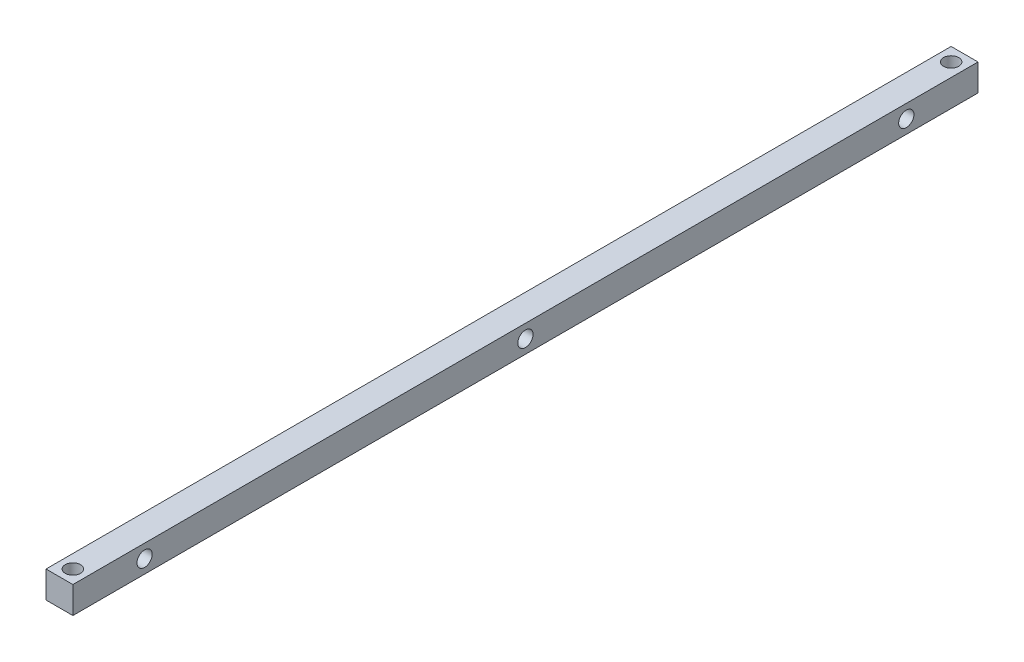
ISO-10303-21;
HEADER;
FILE_DESCRIPTION(('STEP AP214'),'2;1');
FILE_NAME('part.step','',(''),(''),'','','');
FILE_SCHEMA(('AUTOMOTIVE_DESIGN { 1 0 10303 214 1 1 1 1 }'));
ENDSEC;
DATA;
#1=APPLICATION_CONTEXT('core data for automotive mechanical design processes');
#2=APPLICATION_PROTOCOL_DEFINITION('international standard','automotive_design',2000,#1);
#3=PRODUCT_CONTEXT('',#1,'mechanical');
#4=PRODUCT('Part','Part','',(#3));
#5=PRODUCT_RELATED_PRODUCT_CATEGORY('part','',(#4));
#6=PRODUCT_DEFINITION_FORMATION('','',#4);
#7=PRODUCT_DEFINITION_CONTEXT('part definition',#1,'design');
#8=PRODUCT_DEFINITION('design','',#6,#7);
#9=PRODUCT_DEFINITION_SHAPE('','',#8);
#10=(LENGTH_UNIT() NAMED_UNIT(*) SI_UNIT(.MILLI.,.METRE.));
#11=(NAMED_UNIT(*) PLANE_ANGLE_UNIT() SI_UNIT($,.RADIAN.));
#12=(NAMED_UNIT(*) SI_UNIT($,.STERADIAN.) SOLID_ANGLE_UNIT());
#13=UNCERTAINTY_MEASURE_WITH_UNIT(LENGTH_MEASURE(1.E-05),#10,'distance_accuracy_value','');
#14=(GEOMETRIC_REPRESENTATION_CONTEXT(3) GLOBAL_UNCERTAINTY_ASSIGNED_CONTEXT((#13)) GLOBAL_UNIT_ASSIGNED_CONTEXT((#10,
#11,#12)) REPRESENTATION_CONTEXT('',''));
#15=CARTESIAN_POINT('',(0.,0.,0.));
#16=DIRECTION('',(0.,0.,1.));
#17=DIRECTION('',(1.,0.,0.));
#18=AXIS2_PLACEMENT_3D('',#15,#16,#17);
#19=CARTESIAN_POINT('',(-7.5,0.,212.5));
#20=DIRECTION('',(-1.,0.,0.));
#21=DIRECTION('',(0.,0.,1.));
#22=AXIS2_PLACEMENT_3D('',#19,#20,#21);
#23=CYLINDRICAL_SURFACE('',#22,7.00000000000001);
#24=CARTESIAN_POINT('',(0.500000000000003,0.,212.5));
#25=DIRECTION('',(-1.,0.,0.));
#26=DIRECTION('',(0.,0.,1.));
#27=AXIS2_PLACEMENT_3D('',#24,#25,#26);
#28=CIRCLE('',#27,7.00000000000001);
#29=CARTESIAN_POINT('',(0.500000000000003,0.,219.5));
#30=VERTEX_POINT('',#29);
#31=EDGE_CURVE('E11',#30,#30,#28,.T.);
#32=ORIENTED_EDGE('',*,*,#31,.F.);
#33=EDGE_LOOP('',(#32));
#34=FACE_BOUND('',#33,.T.);
#35=CARTESIAN_POINT('',(-7.5,0.,212.5));
#36=DIRECTION('',(-1.,0.,0.));
#37=DIRECTION('',(0.,0.,1.));
#38=AXIS2_PLACEMENT_3D('',#35,#36,#37);
#39=CIRCLE('',#38,7.00000000000001);
#40=CARTESIAN_POINT('',(-7.5,0.,219.5));
#41=VERTEX_POINT('',#40);
#42=EDGE_CURVE('E114',#41,#41,#39,.T.);
#43=ORIENTED_EDGE('',*,*,#42,.T.);
#44=EDGE_LOOP('',(#43));
#45=FACE_BOUND('',#44,.T.);
#46=ADVANCED_FACE('F36',(#34,#45),#23,.F.);
#47=CARTESIAN_POINT('',(0.500000000000003,4.25000000000001,212.5));
#48=DIRECTION('',(1.,0.,0.));
#49=DIRECTION('',(0.,0.,-1.));
#50=AXIS2_PLACEMENT_3D('',#47,#48,#49);
#51=PLANE('',#50);
#52=CARTESIAN_POINT('',(0.500000000000003,0.,212.5));
#53=DIRECTION('',(-1.,0.,0.));
#54=DIRECTION('',(0.,0.,1.));
#55=AXIS2_PLACEMENT_3D('',#52,#53,#54);
#56=CIRCLE('',#55,4.25000000000001);
#57=CARTESIAN_POINT('',(0.500000000000003,0.,216.75));
#58=VERTEX_POINT('',#57);
#59=EDGE_CURVE('E44',#58,#58,#56,.T.);
#60=ORIENTED_EDGE('',*,*,#59,.F.);
#61=EDGE_LOOP('',(#60));
#62=FACE_BOUND('',#61,.T.);
#63=ORIENTED_EDGE('',*,*,#31,.T.);
#64=EDGE_LOOP('',(#63));
#65=FACE_BOUND('',#64,.T.);
#66=ADVANCED_FACE('F124',(#62,#65),#51,.F.);
#67=CARTESIAN_POINT('',(-7.5,0.,212.5));
#68=DIRECTION('',(-1.,0.,0.));
#69=DIRECTION('',(0.,0.,1.));
#70=AXIS2_PLACEMENT_3D('',#67,#68,#69);
#71=CYLINDRICAL_SURFACE('',#70,4.25000000000001);
#72=CARTESIAN_POINT('',(7.5,0.,212.5));
#73=DIRECTION('',(-1.,0.,0.));
#74=DIRECTION('',(0.,0.,1.));
#75=AXIS2_PLACEMENT_3D('',#72,#73,#74);
#76=CIRCLE('',#75,4.25000000000001);
#77=CARTESIAN_POINT('',(7.5,0.,216.75));
#78=VERTEX_POINT('',#77);
#79=EDGE_CURVE('E117',#78,#78,#76,.T.);
#80=ORIENTED_EDGE('',*,*,#79,.F.);
#81=EDGE_LOOP('',(#80));
#82=FACE_BOUND('',#81,.T.);
#83=ORIENTED_EDGE('',*,*,#59,.T.);
#84=EDGE_LOOP('',(#83));
#85=FACE_BOUND('',#84,.T.);
#86=ADVANCED_FACE('F122',(#82,#85),#71,.F.);
#87=CARTESIAN_POINT('',(7.5,-7.5,252.5));
#88=DIRECTION('',(-1.,0.,0.));
#89=DIRECTION('',(0.,0.,1.));
#90=AXIS2_PLACEMENT_3D('',#87,#88,#89);
#91=PLANE('',#90);
#92=CARTESIAN_POINT('',(7.5,0.,0.));
#93=DIRECTION('',(-1.,0.,0.));
#94=DIRECTION('',(0.,0.,1.));
#95=AXIS2_PLACEMENT_3D('',#92,#93,#94);
#96=CIRCLE('',#95,4.25000000000001);
#97=CARTESIAN_POINT('',(7.5,0.,4.25000000000001));
#98=VERTEX_POINT('',#97);
#99=EDGE_CURVE('E377',#98,#98,#96,.T.);
#100=ORIENTED_EDGE('',*,*,#99,.T.);
#101=EDGE_LOOP('',(#100));
#102=FACE_BOUND('',#101,.T.);
#103=CARTESIAN_POINT('',(7.5,0.,-212.5));
#104=DIRECTION('',(-1.,0.,0.));
#105=DIRECTION('',(0.,0.,1.));
#106=AXIS2_PLACEMENT_3D('',#103,#104,#105);
#107=CIRCLE('',#106,4.25000000000001);
#108=CARTESIAN_POINT('',(7.5,0.,-208.25));
#109=VERTEX_POINT('',#108);
#110=EDGE_CURVE('E359',#109,#109,#107,.T.);
#111=ORIENTED_EDGE('',*,*,#110,.T.);
#112=EDGE_LOOP('',(#111));
#113=FACE_BOUND('',#112,.T.);
#114=DIRECTION('',(0.,1.,0.));
#115=VECTOR('',#114,1.);
#116=CARTESIAN_POINT('',(7.5,-7.5,-252.5));
#117=LINE('',#116,#115);
#118=CARTESIAN_POINT('',(7.5,-7.5,-252.5));
#119=VERTEX_POINT('',#118);
#120=CARTESIAN_POINT('',(7.5,7.5,-252.5));
#121=VERTEX_POINT('',#120);
#122=EDGE_CURVE('E104',#119,#121,#117,.T.);
#123=ORIENTED_EDGE('',*,*,#122,.T.);
#124=DIRECTION('',(0.,0.,-1.));
#125=VECTOR('',#124,1.);
#126=CARTESIAN_POINT('',(7.5,7.5,252.5));
#127=LINE('',#126,#125);
#128=CARTESIAN_POINT('',(7.5,7.5,252.5));
#129=VERTEX_POINT('',#128);
#130=EDGE_CURVE('E94',#129,#121,#127,.T.);
#131=ORIENTED_EDGE('',*,*,#130,.F.);
#132=DIRECTION('',(0.,1.,0.));
#133=VECTOR('',#132,1.);
#134=CARTESIAN_POINT('',(7.5,-7.5,252.5));
#135=LINE('',#134,#133);
#136=CARTESIAN_POINT('',(7.5,-7.5,252.5));
#137=VERTEX_POINT('',#136);
#138=EDGE_CURVE('E88',#137,#129,#135,.T.);
#139=ORIENTED_EDGE('',*,*,#138,.F.);
#140=DIRECTION('',(0.,0.,-1.));
#141=VECTOR('',#140,1.);
#142=CARTESIAN_POINT('',(7.5,-7.5,252.5));
#143=LINE('',#142,#141);
#144=EDGE_CURVE('E100',#137,#119,#143,.T.);
#145=ORIENTED_EDGE('',*,*,#144,.T.);
#146=EDGE_LOOP('',(#123,#131,#139,#145));
#147=FACE_BOUND('',#146,.T.);
#148=ORIENTED_EDGE('',*,*,#79,.T.);
#149=EDGE_LOOP('',(#148));
#150=FACE_BOUND('',#149,.T.);
#151=ADVANCED_FACE('F144',(#102,#113,#147,#150),#91,.F.);
#152=CARTESIAN_POINT('',(-7.5,7.5,252.5));
#153=DIRECTION('',(0.,-1.,0.));
#154=DIRECTION('',(0.,0.,-1.));
#155=AXIS2_PLACEMENT_3D('',#152,#153,#154);
#156=PLANE('',#155);
#157=CARTESIAN_POINT('',(0.,7.5,245.));
#158=DIRECTION('',(0.,-1.,0.));
#159=DIRECTION('',(0.,0.,-1.));
#160=AXIS2_PLACEMENT_3D('',#157,#158,#159);
#161=CIRCLE('',#160,4.25000000000001);
#162=CARTESIAN_POINT('',(0.,7.5,240.75));
#163=VERTEX_POINT('',#162);
#164=EDGE_CURVE('E347',#163,#163,#161,.T.);
#165=ORIENTED_EDGE('',*,*,#164,.T.);
#166=EDGE_LOOP('',(#165));
#167=FACE_BOUND('',#166,.T.);
#168=CARTESIAN_POINT('',(0.,7.5,-245.));
#169=DIRECTION('',(0.,-1.,0.));
#170=DIRECTION('',(0.,0.,-1.));
#171=AXIS2_PLACEMENT_3D('',#168,#169,#170);
#172=CIRCLE('',#171,4.25000000000001);
#173=CARTESIAN_POINT('',(0.,7.5,-249.25));
#174=VERTEX_POINT('',#173);
#175=EDGE_CURVE('E107',#174,#174,#172,.T.);
#176=ORIENTED_EDGE('',*,*,#175,.T.);
#177=EDGE_LOOP('',(#176));
#178=FACE_BOUND('',#177,.T.);
#179=DIRECTION('',(-1.,0.,0.));
#180=VECTOR('',#179,1.);
#181=CARTESIAN_POINT('',(-7.5,7.5,-252.5));
#182=LINE('',#181,#180);
#183=CARTESIAN_POINT('',(-7.5,7.5,-252.5));
#184=VERTEX_POINT('',#183);
#185=EDGE_CURVE('E93',#121,#184,#182,.T.);
#186=ORIENTED_EDGE('',*,*,#185,.T.);
#187=DIRECTION('',(0.,0.,-1.));
#188=VECTOR('',#187,1.);
#189=CARTESIAN_POINT('',(-7.5,7.5,252.5));
#190=LINE('',#189,#188);
#191=CARTESIAN_POINT('',(-7.5,7.5,252.5));
#192=VERTEX_POINT('',#191);
#193=EDGE_CURVE('E91',#192,#184,#190,.T.);
#194=ORIENTED_EDGE('',*,*,#193,.F.);
#195=DIRECTION('',(-1.,0.,0.));
#196=VECTOR('',#195,1.);
#197=CARTESIAN_POINT('',(-7.5,7.5,252.5));
#198=LINE('',#197,#196);
#199=EDGE_CURVE('E83',#129,#192,#198,.T.);
#200=ORIENTED_EDGE('',*,*,#199,.F.);
#201=ORIENTED_EDGE('',*,*,#130,.T.);
#202=EDGE_LOOP('',(#186,#194,#200,#201));
#203=FACE_BOUND('',#202,.T.);
#204=ADVANCED_FACE('F92',(#167,#178,#203),#156,.F.);
#205=CARTESIAN_POINT('',(-7.5,-7.5,252.5));
#206=DIRECTION('',(1.,0.,0.));
#207=DIRECTION('',(0.,0.,-1.));
#208=AXIS2_PLACEMENT_3D('',#205,#206,#207);
#209=PLANE('',#208);
#210=CARTESIAN_POINT('',(-7.5,0.,0.));
#211=DIRECTION('',(-1.,0.,0.));
#212=DIRECTION('',(0.,0.,1.));
#213=AXIS2_PLACEMENT_3D('',#210,#211,#212);
#214=CIRCLE('',#213,7.00000000000001);
#215=CARTESIAN_POINT('',(-7.5,0.,7.00000000000001));
#216=VERTEX_POINT('',#215);
#217=EDGE_CURVE('E380',#216,#216,#214,.T.);
#218=ORIENTED_EDGE('',*,*,#217,.F.);
#219=EDGE_LOOP('',(#218));
#220=FACE_BOUND('',#219,.T.);
#221=CARTESIAN_POINT('',(-7.5,0.,-212.5));
#222=DIRECTION('',(-1.,0.,0.));
#223=DIRECTION('',(0.,0.,1.));
#224=AXIS2_PLACEMENT_3D('',#221,#222,#223);
#225=CIRCLE('',#224,7.00000000000001);
#226=CARTESIAN_POINT('',(-7.5,0.,-205.5));
#227=VERTEX_POINT('',#226);
#228=EDGE_CURVE('E368',#227,#227,#225,.T.);
#229=ORIENTED_EDGE('',*,*,#228,.F.);
#230=EDGE_LOOP('',(#229));
#231=FACE_BOUND('',#230,.T.);
#232=DIRECTION('',(0.,-1.,0.));
#233=VECTOR('',#232,1.);
#234=CARTESIAN_POINT('',(-7.5,-7.5,-252.5));
#235=LINE('',#234,#233);
#236=CARTESIAN_POINT('',(-7.5,-7.5,-252.5));
#237=VERTEX_POINT('',#236);
#238=EDGE_CURVE('E69',#184,#237,#235,.T.);
#239=ORIENTED_EDGE('',*,*,#238,.T.);
#240=DIRECTION('',(0.,0.,-1.));
#241=VECTOR('',#240,1.);
#242=CARTESIAN_POINT('',(-7.5,-7.5,252.5));
#243=LINE('',#242,#241);
#244=CARTESIAN_POINT('',(-7.5,-7.5,252.5));
#245=VERTEX_POINT('',#244);
#246=EDGE_CURVE('E95',#245,#237,#243,.T.);
#247=ORIENTED_EDGE('',*,*,#246,.F.);
#248=DIRECTION('',(0.,-1.,0.));
#249=VECTOR('',#248,1.);
#250=CARTESIAN_POINT('',(-7.5,-7.5,252.5));
#251=LINE('',#250,#249);
#252=EDGE_CURVE('E86',#192,#245,#251,.T.);
#253=ORIENTED_EDGE('',*,*,#252,.F.);
#254=ORIENTED_EDGE('',*,*,#193,.T.);
#255=EDGE_LOOP('',(#239,#247,#253,#254));
#256=FACE_BOUND('',#255,.T.);
#257=ORIENTED_EDGE('',*,*,#42,.F.);
#258=EDGE_LOOP('',(#257));
#259=FACE_BOUND('',#258,.T.);
#260=ADVANCED_FACE('F97',(#220,#231,#256,#259),#209,.F.);
#261=CARTESIAN_POINT('',(-7.5,-7.5,252.5));
#262=DIRECTION('',(0.,1.,0.));
#263=DIRECTION('',(0.,0.,1.));
#264=AXIS2_PLACEMENT_3D('',#261,#262,#263);
#265=PLANE('',#264);
#266=CARTESIAN_POINT('',(0.,-7.5,245.));
#267=DIRECTION('',(0.,-1.,0.));
#268=DIRECTION('',(0.,0.,-1.));
#269=AXIS2_PLACEMENT_3D('',#266,#267,#268);
#270=CIRCLE('',#269,7.00000000000001);
#271=CARTESIAN_POINT('',(0.,-7.5,238.));
#272=VERTEX_POINT('',#271);
#273=EDGE_CURVE('E356',#272,#272,#270,.T.);
#274=ORIENTED_EDGE('',*,*,#273,.F.);
#275=EDGE_LOOP('',(#274));
#276=FACE_BOUND('',#275,.T.);
#277=CARTESIAN_POINT('',(0.,-7.5,-245.));
#278=DIRECTION('',(0.,-1.,0.));
#279=DIRECTION('',(0.,0.,-1.));
#280=AXIS2_PLACEMENT_3D('',#277,#278,#279);
#281=CIRCLE('',#280,7.00000000000001);
#282=CARTESIAN_POINT('',(0.,-7.5,-252.));
#283=VERTEX_POINT('',#282);
#284=EDGE_CURVE('E344',#283,#283,#281,.T.);
#285=ORIENTED_EDGE('',*,*,#284,.F.);
#286=EDGE_LOOP('',(#285));
#287=FACE_BOUND('',#286,.T.);
#288=DIRECTION('',(1.,0.,0.));
#289=VECTOR('',#288,1.);
#290=CARTESIAN_POINT('',(-7.5,-7.5,-252.5));
#291=LINE('',#290,#289);
#292=EDGE_CURVE('E75',#237,#119,#291,.T.);
#293=ORIENTED_EDGE('',*,*,#292,.T.);
#294=ORIENTED_EDGE('',*,*,#144,.F.);
#295=DIRECTION('',(1.,0.,0.));
#296=VECTOR('',#295,1.);
#297=CARTESIAN_POINT('',(-7.5,-7.5,252.5));
#298=LINE('',#297,#296);
#299=EDGE_CURVE('E52',#245,#137,#298,.T.);
#300=ORIENTED_EDGE('',*,*,#299,.F.);
#301=ORIENTED_EDGE('',*,*,#246,.T.);
#302=EDGE_LOOP('',(#293,#294,#300,#301));
#303=FACE_BOUND('',#302,.T.);
#304=ADVANCED_FACE('F133',(#276,#287,#303),#265,.F.);
#305=CARTESIAN_POINT('',(0.,0.,252.5));
#306=DIRECTION('',(0.,0.,-1.));
#307=DIRECTION('',(-1.,0.,0.));
#308=AXIS2_PLACEMENT_3D('',#305,#306,#307);
#309=PLANE('',#308);
#310=ORIENTED_EDGE('',*,*,#138,.T.);
#311=ORIENTED_EDGE('',*,*,#199,.T.);
#312=ORIENTED_EDGE('',*,*,#252,.T.);
#313=ORIENTED_EDGE('',*,*,#299,.T.);
#314=EDGE_LOOP('',(#310,#311,#312,#313));
#315=FACE_BOUND('',#314,.T.);
#316=ADVANCED_FACE('F84',(#315),#309,.F.);
#317=CARTESIAN_POINT('',(0.,0.,-252.5));
#318=DIRECTION('',(0.,0.,-1.));
#319=DIRECTION('',(-1.,0.,0.));
#320=AXIS2_PLACEMENT_3D('',#317,#318,#319);
#321=PLANE('',#320);
#322=ORIENTED_EDGE('',*,*,#122,.F.);
#323=ORIENTED_EDGE('',*,*,#292,.F.);
#324=ORIENTED_EDGE('',*,*,#238,.F.);
#325=ORIENTED_EDGE('',*,*,#185,.F.);
#326=EDGE_LOOP('',(#322,#323,#324,#325));
#327=FACE_BOUND('',#326,.T.);
#328=ADVANCED_FACE('F285',(#327),#321,.T.);
#329=CARTESIAN_POINT('',(0.,-7.5,-245.));
#330=DIRECTION('',(0.,-1.,0.));
#331=DIRECTION('',(0.,0.,-1.));
#332=AXIS2_PLACEMENT_3D('',#329,#330,#331);
#333=CYLINDRICAL_SURFACE('',#332,4.25000000000001);
#334=ORIENTED_EDGE('',*,*,#175,.F.);
#335=EDGE_LOOP('',(#334));
#336=FACE_BOUND('',#335,.T.);
#337=CARTESIAN_POINT('',(0.,0.5,-245.));
#338=DIRECTION('',(0.,-1.,0.));
#339=DIRECTION('',(0.,0.,-1.));
#340=AXIS2_PLACEMENT_3D('',#337,#338,#339);
#341=CIRCLE('',#340,4.25000000000001);
#342=CARTESIAN_POINT('',(0.,0.5,-249.25));
#343=VERTEX_POINT('',#342);
#344=EDGE_CURVE('E338',#343,#343,#341,.T.);
#345=ORIENTED_EDGE('',*,*,#344,.T.);
#346=EDGE_LOOP('',(#345));
#347=FACE_BOUND('',#346,.T.);
#348=ADVANCED_FACE('F276',(#336,#347),#333,.F.);
#349=CARTESIAN_POINT('',(4.25000000000001,0.5,-245.));
#350=DIRECTION('',(0.,1.,0.));
#351=DIRECTION('',(0.,0.,1.));
#352=AXIS2_PLACEMENT_3D('',#349,#350,#351);
#353=PLANE('',#352);
#354=ORIENTED_EDGE('',*,*,#344,.F.);
#355=EDGE_LOOP('',(#354));
#356=FACE_BOUND('',#355,.T.);
#357=CARTESIAN_POINT('',(0.,0.5,-245.));
#358=DIRECTION('',(0.,-1.,0.));
#359=DIRECTION('',(0.,0.,-1.));
#360=AXIS2_PLACEMENT_3D('',#357,#358,#359);
#361=CIRCLE('',#360,7.00000000000001);
#362=CARTESIAN_POINT('',(0.,0.5,-252.));
#363=VERTEX_POINT('',#362);
#364=EDGE_CURVE('E341',#363,#363,#361,.T.);
#365=ORIENTED_EDGE('',*,*,#364,.T.);
#366=EDGE_LOOP('',(#365));
#367=FACE_BOUND('',#366,.T.);
#368=ADVANCED_FACE('F267',(#356,#367),#353,.F.);
#369=CARTESIAN_POINT('',(0.,-7.5,-245.));
#370=DIRECTION('',(0.,-1.,0.));
#371=DIRECTION('',(0.,0.,-1.));
#372=AXIS2_PLACEMENT_3D('',#369,#370,#371);
#373=CYLINDRICAL_SURFACE('',#372,7.00000000000001);
#374=ORIENTED_EDGE('',*,*,#364,.F.);
#375=EDGE_LOOP('',(#374));
#376=FACE_BOUND('',#375,.T.);
#377=ORIENTED_EDGE('',*,*,#284,.T.);
#378=EDGE_LOOP('',(#377));
#379=FACE_BOUND('',#378,.T.);
#380=ADVANCED_FACE('F258',(#376,#379),#373,.F.);
#381=CARTESIAN_POINT('',(0.,-7.5,245.));
#382=DIRECTION('',(0.,-1.,0.));
#383=DIRECTION('',(0.,0.,-1.));
#384=AXIS2_PLACEMENT_3D('',#381,#382,#383);
#385=CYLINDRICAL_SURFACE('',#384,4.25000000000001);
#386=ORIENTED_EDGE('',*,*,#164,.F.);
#387=EDGE_LOOP('',(#386));
#388=FACE_BOUND('',#387,.T.);
#389=CARTESIAN_POINT('',(0.,0.5,245.));
#390=DIRECTION('',(0.,-1.,0.));
#391=DIRECTION('',(0.,0.,-1.));
#392=AXIS2_PLACEMENT_3D('',#389,#390,#391);
#393=CIRCLE('',#392,4.25000000000001);
#394=CARTESIAN_POINT('',(0.,0.5,240.75));
#395=VERTEX_POINT('',#394);
#396=EDGE_CURVE('E350',#395,#395,#393,.T.);
#397=ORIENTED_EDGE('',*,*,#396,.T.);
#398=EDGE_LOOP('',(#397));
#399=FACE_BOUND('',#398,.T.);
#400=ADVANCED_FACE('F249',(#388,#399),#385,.F.);
#401=CARTESIAN_POINT('',(4.25000000000001,0.5,245.));
#402=DIRECTION('',(0.,1.,0.));
#403=DIRECTION('',(0.,0.,1.));
#404=AXIS2_PLACEMENT_3D('',#401,#402,#403);
#405=PLANE('',#404);
#406=ORIENTED_EDGE('',*,*,#396,.F.);
#407=EDGE_LOOP('',(#406));
#408=FACE_BOUND('',#407,.T.);
#409=CARTESIAN_POINT('',(0.,0.5,245.));
#410=DIRECTION('',(0.,-1.,0.));
#411=DIRECTION('',(0.,0.,-1.));
#412=AXIS2_PLACEMENT_3D('',#409,#410,#411);
#413=CIRCLE('',#412,7.00000000000001);
#414=CARTESIAN_POINT('',(0.,0.5,238.));
#415=VERTEX_POINT('',#414);
#416=EDGE_CURVE('E353',#415,#415,#413,.T.);
#417=ORIENTED_EDGE('',*,*,#416,.T.);
#418=EDGE_LOOP('',(#417));
#419=FACE_BOUND('',#418,.T.);
#420=ADVANCED_FACE('F240',(#408,#419),#405,.F.);
#421=CARTESIAN_POINT('',(0.,-7.5,245.));
#422=DIRECTION('',(0.,-1.,0.));
#423=DIRECTION('',(0.,0.,-1.));
#424=AXIS2_PLACEMENT_3D('',#421,#422,#423);
#425=CYLINDRICAL_SURFACE('',#424,7.00000000000001);
#426=ORIENTED_EDGE('',*,*,#416,.F.);
#427=EDGE_LOOP('',(#426));
#428=FACE_BOUND('',#427,.T.);
#429=ORIENTED_EDGE('',*,*,#273,.T.);
#430=EDGE_LOOP('',(#429));
#431=FACE_BOUND('',#430,.T.);
#432=ADVANCED_FACE('F169',(#428,#431),#425,.F.);
#433=CARTESIAN_POINT('',(-7.5,0.,-212.5));
#434=DIRECTION('',(-1.,0.,0.));
#435=DIRECTION('',(0.,0.,1.));
#436=AXIS2_PLACEMENT_3D('',#433,#434,#435);
#437=CYLINDRICAL_SURFACE('',#436,4.25000000000001);
#438=ORIENTED_EDGE('',*,*,#110,.F.);
#439=EDGE_LOOP('',(#438));
#440=FACE_BOUND('',#439,.T.);
#441=CARTESIAN_POINT('',(0.500000000000003,0.,-212.5));
#442=DIRECTION('',(-1.,0.,0.));
#443=DIRECTION('',(0.,0.,1.));
#444=AXIS2_PLACEMENT_3D('',#441,#442,#443);
#445=CIRCLE('',#444,4.25000000000001);
#446=CARTESIAN_POINT('',(0.500000000000003,0.,-208.25));
#447=VERTEX_POINT('',#446);
#448=EDGE_CURVE('E362',#447,#447,#445,.T.);
#449=ORIENTED_EDGE('',*,*,#448,.T.);
#450=EDGE_LOOP('',(#449));
#451=FACE_BOUND('',#450,.T.);
#452=ADVANCED_FACE('F164',(#440,#451),#437,.F.);
#453=CARTESIAN_POINT('',(0.500000000000003,4.25000000000001,-212.5));
#454=DIRECTION('',(1.,0.,0.));
#455=DIRECTION('',(0.,0.,-1.));
#456=AXIS2_PLACEMENT_3D('',#453,#454,#455);
#457=PLANE('',#456);
#458=ORIENTED_EDGE('',*,*,#448,.F.);
#459=EDGE_LOOP('',(#458));
#460=FACE_BOUND('',#459,.T.);
#461=CARTESIAN_POINT('',(0.500000000000003,0.,-212.5));
#462=DIRECTION('',(-1.,0.,0.));
#463=DIRECTION('',(0.,0.,1.));
#464=AXIS2_PLACEMENT_3D('',#461,#462,#463);
#465=CIRCLE('',#464,7.00000000000001);
#466=CARTESIAN_POINT('',(0.500000000000003,0.,-205.5));
#467=VERTEX_POINT('',#466);
#468=EDGE_CURVE('E365',#467,#467,#465,.T.);
#469=ORIENTED_EDGE('',*,*,#468,.T.);
#470=EDGE_LOOP('',(#469));
#471=FACE_BOUND('',#470,.T.);
#472=ADVANCED_FACE('F168',(#460,#471),#457,.F.);
#473=CARTESIAN_POINT('',(-7.5,0.,-212.5));
#474=DIRECTION('',(-1.,0.,0.));
#475=DIRECTION('',(0.,0.,1.));
#476=AXIS2_PLACEMENT_3D('',#473,#474,#475);
#477=CYLINDRICAL_SURFACE('',#476,7.00000000000001);
#478=ORIENTED_EDGE('',*,*,#468,.F.);
#479=EDGE_LOOP('',(#478));
#480=FACE_BOUND('',#479,.T.);
#481=ORIENTED_EDGE('',*,*,#228,.T.);
#482=EDGE_LOOP('',(#481));
#483=FACE_BOUND('',#482,.T.);
#484=ADVANCED_FACE('F178',(#480,#483),#477,.F.);
#485=CARTESIAN_POINT('',(-7.5,0.,0.));
#486=DIRECTION('',(-1.,0.,0.));
#487=DIRECTION('',(0.,0.,1.));
#488=AXIS2_PLACEMENT_3D('',#485,#486,#487);
#489=CYLINDRICAL_SURFACE('',#488,4.25000000000001);
#490=ORIENTED_EDGE('',*,*,#99,.F.);
#491=EDGE_LOOP('',(#490));
#492=FACE_BOUND('',#491,.T.);
#493=CARTESIAN_POINT('',(0.500000000000003,0.,0.));
#494=DIRECTION('',(-1.,0.,0.));
#495=DIRECTION('',(0.,0.,1.));
#496=AXIS2_PLACEMENT_3D('',#493,#494,#495);
#497=CIRCLE('',#496,4.25000000000001);
#498=CARTESIAN_POINT('',(0.500000000000003,0.,4.25000000000001));
#499=VERTEX_POINT('',#498);
#500=EDGE_CURVE('E371',#499,#499,#497,.T.);
#501=ORIENTED_EDGE('',*,*,#500,.T.);
#502=EDGE_LOOP('',(#501));
#503=FACE_BOUND('',#502,.T.);
#504=ADVANCED_FACE('F186',(#492,#503),#489,.F.);
#505=CARTESIAN_POINT('',(0.500000000000003,4.25000000000001,0.));
#506=DIRECTION('',(1.,0.,0.));
#507=DIRECTION('',(0.,0.,-1.));
#508=AXIS2_PLACEMENT_3D('',#505,#506,#507);
#509=PLANE('',#508);
#510=ORIENTED_EDGE('',*,*,#500,.F.);
#511=EDGE_LOOP('',(#510));
#512=FACE_BOUND('',#511,.T.);
#513=CARTESIAN_POINT('',(0.500000000000003,0.,0.));
#514=DIRECTION('',(-1.,0.,0.));
#515=DIRECTION('',(0.,0.,1.));
#516=AXIS2_PLACEMENT_3D('',#513,#514,#515);
#517=CIRCLE('',#516,7.00000000000001);
#518=CARTESIAN_POINT('',(0.500000000000003,0.,7.00000000000001));
#519=VERTEX_POINT('',#518);
#520=EDGE_CURVE('E374',#519,#519,#517,.T.);
#521=ORIENTED_EDGE('',*,*,#520,.T.);
#522=EDGE_LOOP('',(#521));
#523=FACE_BOUND('',#522,.T.);
#524=ADVANCED_FACE('F194',(#512,#523),#509,.F.);
#525=CARTESIAN_POINT('',(-7.5,0.,0.));
#526=DIRECTION('',(-1.,0.,0.));
#527=DIRECTION('',(0.,0.,1.));
#528=AXIS2_PLACEMENT_3D('',#525,#526,#527);
#529=CYLINDRICAL_SURFACE('',#528,7.00000000000001);
#530=ORIENTED_EDGE('',*,*,#520,.F.);
#531=EDGE_LOOP('',(#530));
#532=FACE_BOUND('',#531,.T.);
#533=ORIENTED_EDGE('',*,*,#217,.T.);
#534=EDGE_LOOP('',(#533));
#535=FACE_BOUND('',#534,.T.);
#536=ADVANCED_FACE('F202',(#532,#535),#529,.F.);
#537=CLOSED_SHELL('',(#46,#66,#86,#151,#204,#260,#304,#316,#328,#348,#368,#380,#400,#420,#432,
#452,#472,#484,#504,#524,#536));
#538=MANIFOLD_SOLID_BREP('B2',#537);
#539=ADVANCED_BREP_SHAPE_REPRESENTATION('',(#18,#538),#14);
#540=SHAPE_DEFINITION_REPRESENTATION(#9,#539);
ENDSEC;
END-ISO-10303-21;
